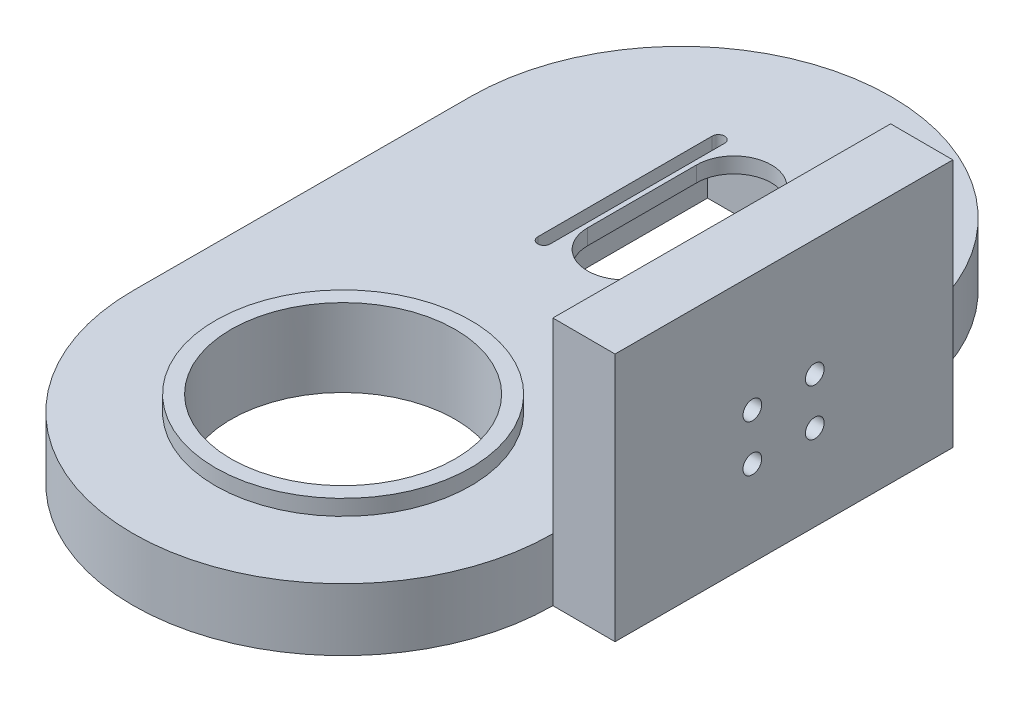
ISO-10303-21;
HEADER;
FILE_DESCRIPTION(('STEP AP214'),'2;1');
FILE_NAME('part.step','',(''),(''),'','','');
FILE_SCHEMA(('AUTOMOTIVE_DESIGN { 1 0 10303 214 1 1 1 1 }'));
ENDSEC;
DATA;
#1=APPLICATION_CONTEXT('core data for automotive mechanical design processes');
#2=APPLICATION_PROTOCOL_DEFINITION('international standard','automotive_design',2000,#1);
#3=PRODUCT_CONTEXT('',#1,'mechanical');
#4=PRODUCT('Part','Part','',(#3));
#5=PRODUCT_RELATED_PRODUCT_CATEGORY('part','',(#4));
#6=PRODUCT_DEFINITION_FORMATION('','',#4);
#7=PRODUCT_DEFINITION_CONTEXT('part definition',#1,'design');
#8=PRODUCT_DEFINITION('design','',#6,#7);
#9=PRODUCT_DEFINITION_SHAPE('','',#8);
#10=(LENGTH_UNIT() NAMED_UNIT(*) SI_UNIT(.MILLI.,.METRE.));
#11=(NAMED_UNIT(*) PLANE_ANGLE_UNIT() SI_UNIT($,.RADIAN.));
#12=(NAMED_UNIT(*) SI_UNIT($,.STERADIAN.) SOLID_ANGLE_UNIT());
#13=UNCERTAINTY_MEASURE_WITH_UNIT(LENGTH_MEASURE(1.E-05),#10,'distance_accuracy_value','');
#14=(GEOMETRIC_REPRESENTATION_CONTEXT(3) GLOBAL_UNCERTAINTY_ASSIGNED_CONTEXT((#13)) GLOBAL_UNIT_ASSIGNED_CONTEXT((#10,
#11,#12)) REPRESENTATION_CONTEXT('',''));
#15=CARTESIAN_POINT('',(0.,0.,0.));
#16=DIRECTION('',(0.,0.,1.));
#17=DIRECTION('',(1.,0.,0.));
#18=AXIS2_PLACEMENT_3D('',#15,#16,#17);
#19=CARTESIAN_POINT('',(0.,20.,0.));
#20=DIRECTION('',(0.,1.,0.));
#21=DIRECTION('',(0.,0.,1.));
#22=AXIS2_PLACEMENT_3D('',#19,#20,#21);
#23=PLANE('',#22);
#24=DIRECTION('',(-0.0022539145486872,0.,0.999997459931378));
#25=VECTOR('',#24,1.);
#26=CARTESIAN_POINT('',(-87.3971740912788,20.,-0.196986262557106));
#27=LINE('',#26,#25);
#28=CARTESIAN_POINT('',(-87.2559419597277,20.,-62.857646088402));
#29=VERTEX_POINT('',#28);
#30=CARTESIAN_POINT('',(-87.499828545368,20.,45.3478607679638));
#31=VERTEX_POINT('',#30);
#32=EDGE_CURVE('E346',#29,#31,#27,.T.);
#33=ORIENTED_EDGE('',*,*,#32,.T.);
#34=CARTESIAN_POINT('',(-20.,20.,45.5000000000001));
#35=DIRECTION('',(0.,1.,0.));
#36=DIRECTION('',(0.,0.,1.));
#37=AXIS2_PLACEMENT_3D('',#34,#35,#36);
#38=CIRCLE('',#37,67.5);
#39=CARTESIAN_POINT('',(47.4998285453679,20.,45.6521392320366));
#40=VERTEX_POINT('',#39);
#41=EDGE_CURVE('E349',#31,#40,#38,.T.);
#42=ORIENTED_EDGE('',*,*,#41,.T.);
#43=DIRECTION('',(0.00225391454868705,0.,-0.999997459931378));
#44=VECTOR('',#43,1.);
#45=CARTESIAN_POINT('',(47.6024829994571,20.,0.107292201515659));
#46=LINE('',#45,#44);
#47=CARTESIAN_POINT('',(47.7437151310082,20.,-62.5533676243292));
#48=VERTEX_POINT('',#47);
#49=EDGE_CURVE('E352',#40,#48,#46,.T.);
#50=ORIENTED_EDGE('',*,*,#49,.T.);
#51=CARTESIAN_POINT('',(-19.7561134143597,20.,-62.7055068563656));
#52=DIRECTION('',(0.,1.,0.));
#53=DIRECTION('',(0.,0.,1.));
#54=AXIS2_PLACEMENT_3D('',#51,#52,#53);
#55=CIRCLE('',#54,67.5);
#56=EDGE_CURVE('E354',#48,#29,#55,.T.);
#57=ORIENTED_EDGE('',*,*,#56,.T.);
#58=EDGE_LOOP('',(#33,#42,#50,#57));
#59=FACE_BOUND('',#58,.T.);
#60=CARTESIAN_POINT('',(-4.5,20.,-90.5));
#61=DIRECTION('',(0.,1.,0.));
#62=DIRECTION('',(0.,0.,1.));
#63=AXIS2_PLACEMENT_3D('',#60,#61,#62);
#64=CIRCLE('',#63,1.99999999999997);
#65=CARTESIAN_POINT('',(-2.50000000000003,20.,-90.5));
#66=VERTEX_POINT('',#65);
#67=CARTESIAN_POINT('',(-6.49999999999998,20.,-90.5));
#68=VERTEX_POINT('',#67);
#69=EDGE_CURVE('E379',#66,#68,#64,.T.);
#70=ORIENTED_EDGE('',*,*,#69,.F.);
#71=DIRECTION('',(0.,0.,1.));
#72=VECTOR('',#71,1.);
#73=CARTESIAN_POINT('',(-2.50000000000003,20.,0.));
#74=LINE('',#73,#72);
#75=CARTESIAN_POINT('',(-2.50000000000003,20.,-34.5));
#76=VERTEX_POINT('',#75);
#77=EDGE_CURVE('E371',#66,#76,#74,.T.);
#78=ORIENTED_EDGE('',*,*,#77,.T.);
#79=CARTESIAN_POINT('',(-4.5,20.,-34.5));
#80=DIRECTION('',(0.,1.,0.));
#81=DIRECTION('',(0.,0.,1.));
#82=AXIS2_PLACEMENT_3D('',#79,#80,#81);
#83=CIRCLE('',#82,1.99999999999997);
#84=CARTESIAN_POINT('',(-6.49999999999998,20.,-34.5));
#85=VERTEX_POINT('',#84);
#86=EDGE_CURVE('E374',#85,#76,#83,.T.);
#87=ORIENTED_EDGE('',*,*,#86,.F.);
#88=DIRECTION('',(0.,0.,1.));
#89=VECTOR('',#88,1.);
#90=CARTESIAN_POINT('',(-6.49999999999998,20.,0.));
#91=LINE('',#90,#89);
#92=EDGE_CURVE('E377',#68,#85,#91,.T.);
#93=ORIENTED_EDGE('',*,*,#92,.F.);
#94=EDGE_LOOP('',(#70,#78,#87,#93));
#95=FACE_BOUND('',#94,.T.);
#96=DIRECTION('',(0.,0.,1.));
#97=VECTOR('',#96,1.);
#98=CARTESIAN_POINT('',(-32.,20.,0.));
#99=LINE('',#98,#97);
#100=CARTESIAN_POINT('',(-32.,20.,-80.));
#101=VERTEX_POINT('',#100);
#102=CARTESIAN_POINT('',(-32.,20.,-45.));
#103=VERTEX_POINT('',#102);
#104=EDGE_CURVE('E388',#101,#103,#99,.T.);
#105=ORIENTED_EDGE('',*,*,#104,.F.);
#106=CARTESIAN_POINT('',(-20.,20.,-80.));
#107=DIRECTION('',(0.,1.,0.));
#108=DIRECTION('',(0.,0.,1.));
#109=AXIS2_PLACEMENT_3D('',#106,#107,#108);
#110=CIRCLE('',#109,12.);
#111=CARTESIAN_POINT('',(-8.00000000000001,20.,-80.));
#112=VERTEX_POINT('',#111);
#113=EDGE_CURVE('E381',#112,#101,#110,.T.);
#114=ORIENTED_EDGE('',*,*,#113,.F.);
#115=DIRECTION('',(0.,0.,1.));
#116=VECTOR('',#115,1.);
#117=CARTESIAN_POINT('',(-8.00000000000001,20.,0.));
#118=LINE('',#117,#116);
#119=CARTESIAN_POINT('',(-8.00000000000001,20.,-45.));
#120=VERTEX_POINT('',#119);
#121=EDGE_CURVE('E383',#112,#120,#118,.T.);
#122=ORIENTED_EDGE('',*,*,#121,.T.);
#123=CARTESIAN_POINT('',(-20.,20.,-45.));
#124=DIRECTION('',(0.,1.,0.));
#125=DIRECTION('',(0.,0.,1.));
#126=AXIS2_PLACEMENT_3D('',#123,#124,#125);
#127=CIRCLE('',#126,12.);
#128=EDGE_CURVE('E386',#103,#120,#127,.T.);
#129=ORIENTED_EDGE('',*,*,#128,.F.);
#130=EDGE_LOOP('',(#105,#114,#122,#129));
#131=FACE_BOUND('',#130,.T.);
#132=CARTESIAN_POINT('',(-35.5,20.,-90.5));
#133=DIRECTION('',(0.,1.,0.));
#134=DIRECTION('',(0.,0.,1.));
#135=AXIS2_PLACEMENT_3D('',#132,#133,#134);
#136=CIRCLE('',#135,2.);
#137=CARTESIAN_POINT('',(-33.5,20.,-90.5));
#138=VERTEX_POINT('',#137);
#139=CARTESIAN_POINT('',(-37.5,20.,-90.5));
#140=VERTEX_POINT('',#139);
#141=EDGE_CURVE('E11',#138,#140,#136,.T.);
#142=ORIENTED_EDGE('',*,*,#141,.F.);
#143=DIRECTION('',(0.,0.,1.));
#144=VECTOR('',#143,1.);
#145=CARTESIAN_POINT('',(-33.5,20.,0.));
#146=LINE('',#145,#144);
#147=CARTESIAN_POINT('',(-33.5,20.,-34.5));
#148=VERTEX_POINT('',#147);
#149=EDGE_CURVE('E390',#138,#148,#146,.T.);
#150=ORIENTED_EDGE('',*,*,#149,.T.);
#151=CARTESIAN_POINT('',(-35.5,20.,-34.5));
#152=DIRECTION('',(0.,1.,0.));
#153=DIRECTION('',(0.,0.,1.));
#154=AXIS2_PLACEMENT_3D('',#151,#152,#153);
#155=CIRCLE('',#154,2.);
#156=CARTESIAN_POINT('',(-37.5,20.,-34.5));
#157=VERTEX_POINT('',#156);
#158=EDGE_CURVE('E393',#157,#148,#155,.T.);
#159=ORIENTED_EDGE('',*,*,#158,.F.);
#160=DIRECTION('',(0.,0.,1.));
#161=VECTOR('',#160,1.);
#162=CARTESIAN_POINT('',(-37.5,20.,0.));
#163=LINE('',#162,#161);
#164=EDGE_CURVE('E45',#140,#157,#163,.T.);
#165=ORIENTED_EDGE('',*,*,#164,.F.);
#166=EDGE_LOOP('',(#142,#150,#159,#165));
#167=FACE_BOUND('',#166,.T.);
#168=CARTESIAN_POINT('',(-20.,20.,45.5));
#169=DIRECTION('',(0.,1.,0.));
#170=DIRECTION('',(0.,0.,1.));
#171=AXIS2_PLACEMENT_3D('',#168,#169,#170);
#172=CIRCLE('',#171,41.);
#173=CARTESIAN_POINT('',(-20.,20.,86.5));
#174=VERTEX_POINT('',#173);
#175=EDGE_CURVE('E236',#174,#174,#172,.T.);
#176=ORIENTED_EDGE('',*,*,#175,.F.);
#177=EDGE_LOOP('',(#176));
#178=FACE_BOUND('',#177,.T.);
#179=ADVANCED_FACE('F37',(#59,#95,#131,#167,#178),#23,.T.);
#180=CARTESIAN_POINT('',(0.,15.,0.));
#181=DIRECTION('',(0.,-1.,0.));
#182=DIRECTION('',(0.,0.,-1.));
#183=AXIS2_PLACEMENT_3D('',#180,#181,#182);
#184=PLANE('',#183);
#185=CARTESIAN_POINT('',(-35.5,15.,-90.5));
#186=DIRECTION('',(0.,-1.,0.));
#187=DIRECTION('',(0.,0.,-1.));
#188=AXIS2_PLACEMENT_3D('',#185,#186,#187);
#189=CIRCLE('',#188,2.);
#190=CARTESIAN_POINT('',(-37.5,15.,-90.5));
#191=VERTEX_POINT('',#190);
#192=CARTESIAN_POINT('',(-35.5,15.,-92.5));
#193=VERTEX_POINT('',#192);
#194=EDGE_CURVE('E251',#191,#193,#189,.T.);
#195=ORIENTED_EDGE('',*,*,#194,.F.);
#196=DIRECTION('',(0.,0.,-1.));
#197=VECTOR('',#196,1.);
#198=CARTESIAN_POINT('',(-37.5,15.,0.));
#199=LINE('',#198,#197);
#200=CARTESIAN_POINT('',(-37.5,15.,-34.5));
#201=VERTEX_POINT('',#200);
#202=EDGE_CURVE('E259',#201,#191,#199,.T.);
#203=ORIENTED_EDGE('',*,*,#202,.F.);
#204=CARTESIAN_POINT('',(-35.5,15.,-34.5));
#205=DIRECTION('',(0.,-1.,0.));
#206=DIRECTION('',(0.,0.,-1.));
#207=AXIS2_PLACEMENT_3D('',#204,#205,#206);
#208=CIRCLE('',#207,2.);
#209=CARTESIAN_POINT('',(-35.5,15.,-32.5));
#210=VERTEX_POINT('',#209);
#211=EDGE_CURVE('E52',#210,#201,#208,.T.);
#212=ORIENTED_EDGE('',*,*,#211,.F.);
#213=DIRECTION('',(-1.,0.,0.));
#214=VECTOR('',#213,1.);
#215=CARTESIAN_POINT('',(0.,15.,-32.5));
#216=LINE('',#215,#214);
#217=CARTESIAN_POINT('',(-41.,15.,-32.5));
#218=VERTEX_POINT('',#217);
#219=EDGE_CURVE('E316',#210,#218,#216,.T.);
#220=ORIENTED_EDGE('',*,*,#219,.T.);
#221=DIRECTION('',(0.,0.,-1.));
#222=VECTOR('',#221,1.);
#223=CARTESIAN_POINT('',(-41.,15.,0.));
#224=LINE('',#223,#222);
#225=CARTESIAN_POINT('',(-41.,15.,-92.5));
#226=VERTEX_POINT('',#225);
#227=EDGE_CURVE('E314',#218,#226,#224,.T.);
#228=ORIENTED_EDGE('',*,*,#227,.T.);
#229=DIRECTION('',(-1.,0.,0.));
#230=VECTOR('',#229,1.);
#231=CARTESIAN_POINT('',(0.,15.,-92.5));
#232=LINE('',#231,#230);
#233=EDGE_CURVE('E319',#193,#226,#232,.T.);
#234=ORIENTED_EDGE('',*,*,#233,.F.);
#235=EDGE_LOOP('',(#195,#203,#212,#220,#228,#234));
#236=FACE_BOUND('',#235,.T.);
#237=ADVANCED_FACE('F422',(#236),#184,.T.);
#238=CARTESIAN_POINT('',(-33.5,15.,-90.5));
#239=VERTEX_POINT('',#238);
#240=EDGE_CURVE('E254',#193,#239,#189,.T.);
#241=ORIENTED_EDGE('',*,*,#240,.F.);
#242=CARTESIAN_POINT('',(-4.5,15.,-92.5));
#243=VERTEX_POINT('',#242);
#244=EDGE_CURVE('E324',#243,#193,#232,.T.);
#245=ORIENTED_EDGE('',*,*,#244,.F.);
#246=CARTESIAN_POINT('',(-4.5,15.,-90.5));
#247=DIRECTION('',(0.,-1.,0.));
#248=DIRECTION('',(0.,0.,-1.));
#249=AXIS2_PLACEMENT_3D('',#246,#247,#248);
#250=CIRCLE('',#249,1.99999999999997);
#251=CARTESIAN_POINT('',(-6.49999999999998,15.,-90.5));
#252=VERTEX_POINT('',#251);
#253=EDGE_CURVE('E291',#252,#243,#250,.T.);
#254=ORIENTED_EDGE('',*,*,#253,.F.);
#255=DIRECTION('',(0.,0.,-1.));
#256=VECTOR('',#255,1.);
#257=CARTESIAN_POINT('',(-6.49999999999998,15.,0.));
#258=LINE('',#257,#256);
#259=CARTESIAN_POINT('',(-6.49999999999998,15.,-34.5));
#260=VERTEX_POINT('',#259);
#261=EDGE_CURVE('E299',#260,#252,#258,.T.);
#262=ORIENTED_EDGE('',*,*,#261,.F.);
#263=CARTESIAN_POINT('',(-4.5,15.,-34.5));
#264=DIRECTION('',(0.,-1.,0.));
#265=DIRECTION('',(0.,0.,-1.));
#266=AXIS2_PLACEMENT_3D('',#263,#264,#265);
#267=CIRCLE('',#266,1.99999999999997);
#268=CARTESIAN_POINT('',(-4.5,15.,-32.5));
#269=VERTEX_POINT('',#268);
#270=EDGE_CURVE('E296',#269,#260,#267,.T.);
#271=ORIENTED_EDGE('',*,*,#270,.F.);
#272=EDGE_CURVE('E315',#269,#210,#216,.T.);
#273=ORIENTED_EDGE('',*,*,#272,.T.);
#274=CARTESIAN_POINT('',(-33.5,15.,-34.5));
#275=VERTEX_POINT('',#274);
#276=EDGE_CURVE('E257',#275,#210,#208,.T.);
#277=ORIENTED_EDGE('',*,*,#276,.F.);
#278=DIRECTION('',(0.,0.,-1.));
#279=VECTOR('',#278,1.);
#280=CARTESIAN_POINT('',(-33.5,15.,0.));
#281=LINE('',#280,#279);
#282=EDGE_CURVE('E253',#275,#239,#281,.T.);
#283=ORIENTED_EDGE('',*,*,#282,.T.);
#284=EDGE_LOOP('',(#241,#245,#254,#262,#271,#273,#277,#283));
#285=FACE_BOUND('',#284,.T.);
#286=DIRECTION('',(0.,0.,-1.));
#287=VECTOR('',#286,1.);
#288=CARTESIAN_POINT('',(-32.,15.,0.));
#289=LINE('',#288,#287);
#290=CARTESIAN_POINT('',(-32.,15.,-45.));
#291=VERTEX_POINT('',#290);
#292=CARTESIAN_POINT('',(-32.,15.,-80.));
#293=VERTEX_POINT('',#292);
#294=EDGE_CURVE('E272',#291,#293,#289,.T.);
#295=ORIENTED_EDGE('',*,*,#294,.F.);
#296=CARTESIAN_POINT('',(-20.,15.,-45.));
#297=DIRECTION('',(0.,-1.,0.));
#298=DIRECTION('',(0.,0.,-1.));
#299=AXIS2_PLACEMENT_3D('',#296,#297,#298);
#300=CIRCLE('',#299,12.);
#301=CARTESIAN_POINT('',(-8.00000000000001,15.,-45.));
#302=VERTEX_POINT('',#301);
#303=EDGE_CURVE('E280',#302,#291,#300,.T.);
#304=ORIENTED_EDGE('',*,*,#303,.F.);
#305=DIRECTION('',(0.,0.,-1.));
#306=VECTOR('',#305,1.);
#307=CARTESIAN_POINT('',(-8.00000000000001,15.,0.));
#308=LINE('',#307,#306);
#309=CARTESIAN_POINT('',(-8.00000000000001,15.,-80.));
#310=VERTEX_POINT('',#309);
#311=EDGE_CURVE('E60',#302,#310,#308,.T.);
#312=ORIENTED_EDGE('',*,*,#311,.T.);
#313=CARTESIAN_POINT('',(-20.,15.,-80.));
#314=DIRECTION('',(0.,-1.,0.));
#315=DIRECTION('',(0.,0.,-1.));
#316=AXIS2_PLACEMENT_3D('',#313,#314,#315);
#317=CIRCLE('',#316,12.);
#318=EDGE_CURVE('E275',#293,#310,#317,.T.);
#319=ORIENTED_EDGE('',*,*,#318,.F.);
#320=EDGE_LOOP('',(#295,#304,#312,#319));
#321=FACE_BOUND('',#320,.T.);
#322=ADVANCED_FACE('F416',(#285,#321),#184,.T.);
#323=CARTESIAN_POINT('',(-87.3971740912788,20.,-0.196986262557106));
#324=DIRECTION('',(0.999997459931378,0.,0.0022539145486872));
#325=DIRECTION('',(0.0022539145486872,0.,-0.999997459931378));
#326=AXIS2_PLACEMENT_3D('',#323,#324,#325);
#327=PLANE('',#326);
#328=DIRECTION('',(-0.0022539145486872,0.,0.999997459931378));
#329=VECTOR('',#328,1.);
#330=CARTESIAN_POINT('',(-87.3971740912788,0.,-0.196986262557106));
#331=LINE('',#330,#329);
#332=CARTESIAN_POINT('',(-87.2559419597277,0.,-62.857646088402));
#333=VERTEX_POINT('',#332);
#334=CARTESIAN_POINT('',(-87.499828545368,0.,45.3478607679638));
#335=VERTEX_POINT('',#334);
#336=EDGE_CURVE('E339',#333,#335,#331,.T.);
#337=ORIENTED_EDGE('',*,*,#336,.T.);
#338=DIRECTION('',(0.,-1.,0.));
#339=VECTOR('',#338,1.);
#340=CARTESIAN_POINT('',(-87.499828545368,20.,45.3478607679638));
#341=LINE('',#340,#339);
#342=EDGE_CURVE('E368',#31,#335,#341,.T.);
#343=ORIENTED_EDGE('',*,*,#342,.F.);
#344=ORIENTED_EDGE('',*,*,#32,.F.);
#345=DIRECTION('',(0.,-1.,0.));
#346=VECTOR('',#345,1.);
#347=CARTESIAN_POINT('',(-87.2559419597277,20.,-62.857646088402));
#348=LINE('',#347,#346);
#349=EDGE_CURVE('E356',#29,#333,#348,.T.);
#350=ORIENTED_EDGE('',*,*,#349,.T.);
#351=EDGE_LOOP('',(#337,#343,#344,#350));
#352=FACE_BOUND('',#351,.T.);
#353=ADVANCED_FACE('F39',(#352),#327,.F.);
#354=CARTESIAN_POINT('',(-20.,20.,45.5000000000001));
#355=DIRECTION('',(0.,-1.,0.));
#356=DIRECTION('',(0.,0.,-1.));
#357=AXIS2_PLACEMENT_3D('',#354,#355,#356);
#358=CYLINDRICAL_SURFACE('',#357,67.5);
#359=CARTESIAN_POINT('',(-20.,0.,45.5000000000001));
#360=DIRECTION('',(0.,1.,0.));
#361=DIRECTION('',(0.,0.,1.));
#362=AXIS2_PLACEMENT_3D('',#359,#360,#361);
#363=CIRCLE('',#362,67.5);
#364=CARTESIAN_POINT('',(47.4998285453679,0.,45.6521392320366));
#365=VERTEX_POINT('',#364);
#366=EDGE_CURVE('E359',#335,#365,#363,.T.);
#367=ORIENTED_EDGE('',*,*,#366,.T.);
#368=DIRECTION('',(0.,-1.,0.));
#369=VECTOR('',#368,1.);
#370=CARTESIAN_POINT('',(47.4998285453679,20.,45.6521392320366));
#371=LINE('',#370,#369);
#372=EDGE_CURVE('E232',#40,#365,#371,.T.);
#373=ORIENTED_EDGE('',*,*,#372,.F.);
#374=ORIENTED_EDGE('',*,*,#41,.F.);
#375=ORIENTED_EDGE('',*,*,#342,.T.);
#376=EDGE_LOOP('',(#367,#373,#374,#375));
#377=FACE_BOUND('',#376,.T.);
#378=ADVANCED_FACE('F485',(#377),#358,.T.);
#379=CARTESIAN_POINT('',(-19.7561134143597,20.,-62.7055068563656));
#380=DIRECTION('',(0.,-1.,0.));
#381=DIRECTION('',(0.,0.,-1.));
#382=AXIS2_PLACEMENT_3D('',#379,#380,#381);
#383=CYLINDRICAL_SURFACE('',#382,67.5);
#384=CARTESIAN_POINT('',(-19.7561134143597,0.,-62.7055068563656));
#385=DIRECTION('',(0.,1.,0.));
#386=DIRECTION('',(0.,0.,1.));
#387=AXIS2_PLACEMENT_3D('',#384,#385,#386);
#388=CIRCLE('',#387,67.5);
#389=CARTESIAN_POINT('',(47.7437151310083,0.,-62.5533676243292));
#390=VERTEX_POINT('',#389);
#391=EDGE_CURVE('E350',#390,#333,#388,.T.);
#392=ORIENTED_EDGE('',*,*,#391,.T.);
#393=ORIENTED_EDGE('',*,*,#349,.F.);
#394=ORIENTED_EDGE('',*,*,#56,.F.);
#395=DIRECTION('',(0.,-1.,0.));
#396=VECTOR('',#395,1.);
#397=CARTESIAN_POINT('',(47.7437151310082,20.,-62.5533676243292));
#398=LINE('',#397,#396);
#399=EDGE_CURVE('E364',#48,#390,#398,.T.);
#400=ORIENTED_EDGE('',*,*,#399,.T.);
#401=EDGE_LOOP('',(#392,#393,#394,#400));
#402=FACE_BOUND('',#401,.T.);
#403=ADVANCED_FACE('F482',(#402),#383,.T.);
#404=CARTESIAN_POINT('',(0.,0.,0.));
#405=DIRECTION('',(0.,1.,0.));
#406=DIRECTION('',(0.,0.,1.));
#407=AXIS2_PLACEMENT_3D('',#404,#405,#406);
#408=PLANE('',#407);
#409=CARTESIAN_POINT('',(-20.,0.,45.5));
#410=DIRECTION('',(0.,-1.,0.));
#411=DIRECTION('',(0.,0.,-1.));
#412=AXIS2_PLACEMENT_3D('',#409,#410,#411);
#413=CIRCLE('',#412,36.);
#414=CARTESIAN_POINT('',(-20.,0.,9.50000000000002));
#415=VERTEX_POINT('',#414);
#416=EDGE_CURVE('E245',#415,#415,#413,.T.);
#417=ORIENTED_EDGE('',*,*,#416,.F.);
#418=EDGE_LOOP('',(#417));
#419=FACE_BOUND('',#418,.T.);
#420=DIRECTION('',(0.,0.,-1.));
#421=VECTOR('',#420,1.);
#422=CARTESIAN_POINT('',(-41.,0.,0.));
#423=LINE('',#422,#421);
#424=CARTESIAN_POINT('',(-41.,0.,-32.5));
#425=VERTEX_POINT('',#424);
#426=CARTESIAN_POINT('',(-41.,0.,-92.5));
#427=VERTEX_POINT('',#426);
#428=EDGE_CURVE('E328',#425,#427,#423,.T.);
#429=ORIENTED_EDGE('',*,*,#428,.F.);
#430=DIRECTION('',(-1.,0.,0.));
#431=VECTOR('',#430,1.);
#432=CARTESIAN_POINT('',(0.,0.,-32.5));
#433=LINE('',#432,#431);
#434=CARTESIAN_POINT('',(0.999999999999973,0.,-32.5));
#435=VERTEX_POINT('',#434);
#436=EDGE_CURVE('E265',#435,#425,#433,.T.);
#437=ORIENTED_EDGE('',*,*,#436,.F.);
#438=DIRECTION('',(0.,0.,-1.));
#439=VECTOR('',#438,1.);
#440=CARTESIAN_POINT('',(0.99999999999997,0.,0.));
#441=LINE('',#440,#439);
#442=CARTESIAN_POINT('',(0.999999999999978,0.,-92.5));
#443=VERTEX_POINT('',#442);
#444=EDGE_CURVE('E334',#435,#443,#441,.T.);
#445=ORIENTED_EDGE('',*,*,#444,.T.);
#446=DIRECTION('',(-1.,0.,0.));
#447=VECTOR('',#446,1.);
#448=CARTESIAN_POINT('',(0.,0.,-92.5));
#449=LINE('',#448,#447);
#450=EDGE_CURVE('E331',#443,#427,#449,.T.);
#451=ORIENTED_EDGE('',*,*,#450,.T.);
#452=EDGE_LOOP('',(#429,#437,#445,#451));
#453=FACE_BOUND('',#452,.T.);
#454=ORIENTED_EDGE('',*,*,#336,.F.);
#455=ORIENTED_EDGE('',*,*,#391,.F.);
#456=DIRECTION('',(-0.999997459931378,0.,-0.00225391454868705));
#457=VECTOR('',#456,1.);
#458=CARTESIAN_POINT('',(67.7436643296358,0.,-62.5082893333555));
#459=LINE('',#458,#457);
#460=CARTESIAN_POINT('',(67.7436643296358,0.,-62.5082893333555));
#461=VERTEX_POINT('',#460);
#462=EDGE_CURVE('E212',#461,#390,#459,.T.);
#463=ORIENTED_EDGE('',*,*,#462,.F.);
#464=DIRECTION('',(0.00225391454868707,0.,-0.999997459931377));
#465=VECTOR('',#464,1.);
#466=CARTESIAN_POINT('',(67.7436643296358,0.,-62.5082893333555));
#467=LINE('',#466,#465);
#468=CARTESIAN_POINT('',(67.4997777439955,0.,45.6972175230103));
#469=VERTEX_POINT('',#468);
#470=EDGE_CURVE('E205',#469,#461,#467,.T.);
#471=ORIENTED_EDGE('',*,*,#470,.F.);
#472=DIRECTION('',(-0.999997459931378,0.,-0.00225391454868705));
#473=VECTOR('',#472,1.);
#474=CARTESIAN_POINT('',(67.4997777439955,0.,45.6972175230103));
#475=LINE('',#474,#473);
#476=EDGE_CURVE('E210',#469,#365,#475,.T.);
#477=ORIENTED_EDGE('',*,*,#476,.T.);
#478=ORIENTED_EDGE('',*,*,#366,.F.);
#479=EDGE_LOOP('',(#454,#455,#463,#471,#477,#478));
#480=FACE_BOUND('',#479,.T.);
#481=ADVANCED_FACE('F208',(#419,#453,#480),#408,.F.);
#482=CARTESIAN_POINT('',(0.,15.,-32.5));
#483=DIRECTION('',(0.,0.,1.));
#484=DIRECTION('',(1.,0.,0.));
#485=AXIS2_PLACEMENT_3D('',#482,#483,#484);
#486=PLANE('',#485);
#487=ORIENTED_EDGE('',*,*,#436,.T.);
#488=DIRECTION('',(0.,-1.,0.));
#489=VECTOR('',#488,1.);
#490=CARTESIAN_POINT('',(-41.,15.,-32.5));
#491=LINE('',#490,#489);
#492=EDGE_CURVE('E326',#218,#425,#491,.T.);
#493=ORIENTED_EDGE('',*,*,#492,.F.);
#494=ORIENTED_EDGE('',*,*,#219,.F.);
#495=ORIENTED_EDGE('',*,*,#272,.F.);
#496=CARTESIAN_POINT('',(0.999999999999973,15.,-32.5));
#497=VERTEX_POINT('',#496);
#498=EDGE_CURVE('E311',#497,#269,#216,.T.);
#499=ORIENTED_EDGE('',*,*,#498,.F.);
#500=DIRECTION('',(0.,-1.,0.));
#501=VECTOR('',#500,1.);
#502=CARTESIAN_POINT('',(0.999999999999973,15.,-32.5));
#503=LINE('',#502,#501);
#504=EDGE_CURVE('E337',#497,#435,#503,.T.);
#505=ORIENTED_EDGE('',*,*,#504,.T.);
#506=EDGE_LOOP('',(#487,#493,#494,#495,#499,#505));
#507=FACE_BOUND('',#506,.T.);
#508=ADVANCED_FACE('F458',(#507),#486,.F.);
#509=CARTESIAN_POINT('',(0.99999999999997,15.,0.));
#510=DIRECTION('',(-1.,0.,0.));
#511=DIRECTION('',(0.,0.,1.));
#512=AXIS2_PLACEMENT_3D('',#509,#510,#511);
#513=PLANE('',#512);
#514=ORIENTED_EDGE('',*,*,#444,.F.);
#515=ORIENTED_EDGE('',*,*,#504,.F.);
#516=DIRECTION('',(0.,0.,-1.));
#517=VECTOR('',#516,1.);
#518=CARTESIAN_POINT('',(0.99999999999997,15.,0.));
#519=LINE('',#518,#517);
#520=CARTESIAN_POINT('',(0.999999999999978,15.,-92.5));
#521=VERTEX_POINT('',#520);
#522=EDGE_CURVE('E323',#497,#521,#519,.T.);
#523=ORIENTED_EDGE('',*,*,#522,.T.);
#524=DIRECTION('',(0.,-1.,0.));
#525=VECTOR('',#524,1.);
#526=CARTESIAN_POINT('',(0.999999999999978,15.,-92.5));
#527=LINE('',#526,#525);
#528=EDGE_CURVE('E340',#521,#443,#527,.T.);
#529=ORIENTED_EDGE('',*,*,#528,.T.);
#530=EDGE_LOOP('',(#514,#515,#523,#529));
#531=FACE_BOUND('',#530,.T.);
#532=ADVANCED_FACE('F633',(#531),#513,.T.);
#533=CARTESIAN_POINT('',(0.,15.,-92.5));
#534=DIRECTION('',(0.,0.,1.));
#535=DIRECTION('',(1.,0.,0.));
#536=AXIS2_PLACEMENT_3D('',#533,#534,#535);
#537=PLANE('',#536);
#538=ORIENTED_EDGE('',*,*,#450,.F.);
#539=ORIENTED_EDGE('',*,*,#528,.F.);
#540=EDGE_CURVE('E320',#521,#243,#232,.T.);
#541=ORIENTED_EDGE('',*,*,#540,.T.);
#542=ORIENTED_EDGE('',*,*,#244,.T.);
#543=ORIENTED_EDGE('',*,*,#233,.T.);
#544=DIRECTION('',(0.,-1.,0.));
#545=VECTOR('',#544,1.);
#546=CARTESIAN_POINT('',(-41.,15.,-92.5));
#547=LINE('',#546,#545);
#548=EDGE_CURVE('E342',#226,#427,#547,.T.);
#549=ORIENTED_EDGE('',*,*,#548,.T.);
#550=EDGE_LOOP('',(#538,#539,#541,#542,#543,#549));
#551=FACE_BOUND('',#550,.T.);
#552=ADVANCED_FACE('F427',(#551),#537,.T.);
#553=CARTESIAN_POINT('',(-41.,15.,0.));
#554=DIRECTION('',(-1.,0.,0.));
#555=DIRECTION('',(0.,0.,1.));
#556=AXIS2_PLACEMENT_3D('',#553,#554,#555);
#557=PLANE('',#556);
#558=ORIENTED_EDGE('',*,*,#428,.T.);
#559=ORIENTED_EDGE('',*,*,#548,.F.);
#560=ORIENTED_EDGE('',*,*,#227,.F.);
#561=ORIENTED_EDGE('',*,*,#492,.T.);
#562=EDGE_LOOP('',(#558,#559,#560,#561));
#563=FACE_BOUND('',#562,.T.);
#564=ADVANCED_FACE('F624',(#563),#557,.F.);
#565=CARTESIAN_POINT('',(-2.50000000000003,15.,-90.5));
#566=VERTEX_POINT('',#565);
#567=EDGE_CURVE('E250',#243,#566,#250,.T.);
#568=ORIENTED_EDGE('',*,*,#567,.F.);
#569=ORIENTED_EDGE('',*,*,#540,.F.);
#570=ORIENTED_EDGE('',*,*,#522,.F.);
#571=ORIENTED_EDGE('',*,*,#498,.T.);
#572=CARTESIAN_POINT('',(-2.50000000000003,15.,-34.5));
#573=VERTEX_POINT('',#572);
#574=EDGE_CURVE('E297',#573,#269,#267,.T.);
#575=ORIENTED_EDGE('',*,*,#574,.F.);
#576=DIRECTION('',(0.,0.,-1.));
#577=VECTOR('',#576,1.);
#578=CARTESIAN_POINT('',(-2.50000000000003,15.,0.));
#579=LINE('',#578,#577);
#580=EDGE_CURVE('E293',#573,#566,#579,.T.);
#581=ORIENTED_EDGE('',*,*,#580,.T.);
#582=EDGE_LOOP('',(#568,#569,#570,#571,#575,#581));
#583=FACE_BOUND('',#582,.T.);
#584=ADVANCED_FACE('F433',(#583),#184,.T.);
#585=CARTESIAN_POINT('',(-4.5,35.,-90.5));
#586=DIRECTION('',(0.,-1.,0.));
#587=DIRECTION('',(0.,0.,-1.));
#588=AXIS2_PLACEMENT_3D('',#585,#586,#587);
#589=CYLINDRICAL_SURFACE('',#588,1.99999999999997);
#590=ORIENTED_EDGE('',*,*,#69,.T.);
#591=DIRECTION('',(0.,-1.,0.));
#592=VECTOR('',#591,1.);
#593=CARTESIAN_POINT('',(-6.49999999999998,35.,-90.5));
#594=LINE('',#593,#592);
#595=EDGE_CURVE('E276',#68,#252,#594,.T.);
#596=ORIENTED_EDGE('',*,*,#595,.T.);
#597=ORIENTED_EDGE('',*,*,#253,.T.);
#598=ORIENTED_EDGE('',*,*,#567,.T.);
#599=DIRECTION('',(0.,-1.,0.));
#600=VECTOR('',#599,1.);
#601=CARTESIAN_POINT('',(-2.50000000000003,35.,-90.5));
#602=LINE('',#601,#600);
#603=EDGE_CURVE('E302',#66,#566,#602,.T.);
#604=ORIENTED_EDGE('',*,*,#603,.F.);
#605=EDGE_LOOP('',(#590,#596,#597,#598,#604));
#606=FACE_BOUND('',#605,.T.);
#607=ADVANCED_FACE('F439',(#606),#589,.F.);
#608=CARTESIAN_POINT('',(-6.49999999999998,35.,0.));
#609=DIRECTION('',(-1.,0.,0.));
#610=DIRECTION('',(0.,0.,1.));
#611=AXIS2_PLACEMENT_3D('',#608,#609,#610);
#612=PLANE('',#611);
#613=ORIENTED_EDGE('',*,*,#92,.T.);
#614=DIRECTION('',(0.,-1.,0.));
#615=VECTOR('',#614,1.);
#616=CARTESIAN_POINT('',(-6.49999999999998,35.,-34.5));
#617=LINE('',#616,#615);
#618=EDGE_CURVE('E304',#85,#260,#617,.T.);
#619=ORIENTED_EDGE('',*,*,#618,.T.);
#620=ORIENTED_EDGE('',*,*,#261,.T.);
#621=ORIENTED_EDGE('',*,*,#595,.F.);
#622=EDGE_LOOP('',(#613,#619,#620,#621));
#623=FACE_BOUND('',#622,.T.);
#624=ADVANCED_FACE('F449',(#623),#612,.F.);
#625=CARTESIAN_POINT('',(-4.5,35.,-34.5));
#626=DIRECTION('',(0.,-1.,0.));
#627=DIRECTION('',(0.,0.,-1.));
#628=AXIS2_PLACEMENT_3D('',#625,#626,#627);
#629=CYLINDRICAL_SURFACE('',#628,1.99999999999997);
#630=ORIENTED_EDGE('',*,*,#86,.T.);
#631=DIRECTION('',(0.,-1.,0.));
#632=VECTOR('',#631,1.);
#633=CARTESIAN_POINT('',(-2.50000000000003,35.,-34.5));
#634=LINE('',#633,#632);
#635=EDGE_CURVE('E307',#76,#573,#634,.T.);
#636=ORIENTED_EDGE('',*,*,#635,.T.);
#637=ORIENTED_EDGE('',*,*,#574,.T.);
#638=ORIENTED_EDGE('',*,*,#270,.T.);
#639=ORIENTED_EDGE('',*,*,#618,.F.);
#640=EDGE_LOOP('',(#630,#636,#637,#638,#639));
#641=FACE_BOUND('',#640,.T.);
#642=ADVANCED_FACE('F460',(#641),#629,.F.);
#643=CARTESIAN_POINT('',(-2.50000000000003,35.,0.));
#644=DIRECTION('',(-1.,0.,0.));
#645=DIRECTION('',(0.,0.,1.));
#646=AXIS2_PLACEMENT_3D('',#643,#644,#645);
#647=PLANE('',#646);
#648=ORIENTED_EDGE('',*,*,#603,.T.);
#649=ORIENTED_EDGE('',*,*,#580,.F.);
#650=ORIENTED_EDGE('',*,*,#635,.F.);
#651=ORIENTED_EDGE('',*,*,#77,.F.);
#652=EDGE_LOOP('',(#648,#649,#650,#651));
#653=FACE_BOUND('',#652,.T.);
#654=ADVANCED_FACE('F442',(#653),#647,.T.);
#655=CARTESIAN_POINT('',(-32.,35.,0.));
#656=DIRECTION('',(-1.,0.,0.));
#657=DIRECTION('',(0.,0.,1.));
#658=AXIS2_PLACEMENT_3D('',#655,#656,#657);
#659=PLANE('',#658);
#660=ORIENTED_EDGE('',*,*,#104,.T.);
#661=DIRECTION('',(0.,-1.,0.));
#662=VECTOR('',#661,1.);
#663=CARTESIAN_POINT('',(-32.,35.,-45.));
#664=LINE('',#663,#662);
#665=EDGE_CURVE('E284',#103,#291,#664,.T.);
#666=ORIENTED_EDGE('',*,*,#665,.T.);
#667=ORIENTED_EDGE('',*,*,#294,.T.);
#668=DIRECTION('',(0.,-1.,0.));
#669=VECTOR('',#668,1.);
#670=CARTESIAN_POINT('',(-32.,35.,-80.));
#671=LINE('',#670,#669);
#672=EDGE_CURVE('E283',#101,#293,#671,.T.);
#673=ORIENTED_EDGE('',*,*,#672,.F.);
#674=EDGE_LOOP('',(#660,#666,#667,#673));
#675=FACE_BOUND('',#674,.T.);
#676=ADVANCED_FACE('F467',(#675),#659,.F.);
#677=CARTESIAN_POINT('',(-20.,35.,-45.));
#678=DIRECTION('',(0.,-1.,0.));
#679=DIRECTION('',(0.,0.,-1.));
#680=AXIS2_PLACEMENT_3D('',#677,#678,#679);
#681=CYLINDRICAL_SURFACE('',#680,12.);
#682=ORIENTED_EDGE('',*,*,#128,.T.);
#683=DIRECTION('',(0.,-1.,0.));
#684=VECTOR('',#683,1.);
#685=CARTESIAN_POINT('',(-8.00000000000001,35.,-45.));
#686=LINE('',#685,#684);
#687=EDGE_CURVE('E286',#120,#302,#686,.T.);
#688=ORIENTED_EDGE('',*,*,#687,.T.);
#689=ORIENTED_EDGE('',*,*,#303,.T.);
#690=ORIENTED_EDGE('',*,*,#665,.F.);
#691=EDGE_LOOP('',(#682,#688,#689,#690));
#692=FACE_BOUND('',#691,.T.);
#693=ADVANCED_FACE('F595',(#692),#681,.F.);
#694=CARTESIAN_POINT('',(-8.00000000000001,35.,0.));
#695=DIRECTION('',(-1.,0.,0.));
#696=DIRECTION('',(0.,0.,1.));
#697=AXIS2_PLACEMENT_3D('',#694,#695,#696);
#698=PLANE('',#697);
#699=DIRECTION('',(0.,-1.,0.));
#700=VECTOR('',#699,1.);
#701=CARTESIAN_POINT('',(-8.00000000000001,35.,-80.));
#702=LINE('',#701,#700);
#703=EDGE_CURVE('E288',#112,#310,#702,.T.);
#704=ORIENTED_EDGE('',*,*,#703,.T.);
#705=ORIENTED_EDGE('',*,*,#311,.F.);
#706=ORIENTED_EDGE('',*,*,#687,.F.);
#707=ORIENTED_EDGE('',*,*,#121,.F.);
#708=EDGE_LOOP('',(#704,#705,#706,#707));
#709=FACE_BOUND('',#708,.T.);
#710=ADVANCED_FACE('F598',(#709),#698,.T.);
#711=CARTESIAN_POINT('',(-20.,35.,-80.));
#712=DIRECTION('',(0.,-1.,0.));
#713=DIRECTION('',(0.,0.,-1.));
#714=AXIS2_PLACEMENT_3D('',#711,#712,#713);
#715=CYLINDRICAL_SURFACE('',#714,12.);
#716=ORIENTED_EDGE('',*,*,#113,.T.);
#717=ORIENTED_EDGE('',*,*,#672,.T.);
#718=ORIENTED_EDGE('',*,*,#318,.T.);
#719=ORIENTED_EDGE('',*,*,#703,.F.);
#720=EDGE_LOOP('',(#716,#717,#718,#719));
#721=FACE_BOUND('',#720,.T.);
#722=ADVANCED_FACE('F594',(#721),#715,.F.);
#723=CARTESIAN_POINT('',(-35.5,35.,-90.5));
#724=DIRECTION('',(0.,-1.,0.));
#725=DIRECTION('',(0.,0.,-1.));
#726=AXIS2_PLACEMENT_3D('',#723,#724,#725);
#727=CYLINDRICAL_SURFACE('',#726,2.);
#728=ORIENTED_EDGE('',*,*,#141,.T.);
#729=DIRECTION('',(0.,-1.,0.));
#730=VECTOR('',#729,1.);
#731=CARTESIAN_POINT('',(-37.5,35.,-90.5));
#732=LINE('',#731,#730);
#733=EDGE_CURVE('E263',#140,#191,#732,.T.);
#734=ORIENTED_EDGE('',*,*,#733,.T.);
#735=ORIENTED_EDGE('',*,*,#194,.T.);
#736=ORIENTED_EDGE('',*,*,#240,.T.);
#737=DIRECTION('',(0.,-1.,0.));
#738=VECTOR('',#737,1.);
#739=CARTESIAN_POINT('',(-33.5,35.,-90.5));
#740=LINE('',#739,#738);
#741=EDGE_CURVE('E262',#138,#239,#740,.T.);
#742=ORIENTED_EDGE('',*,*,#741,.F.);
#743=EDGE_LOOP('',(#728,#734,#735,#736,#742));
#744=FACE_BOUND('',#743,.T.);
#745=ADVANCED_FACE('F410',(#744),#727,.F.);
#746=CARTESIAN_POINT('',(-37.5,35.,0.));
#747=DIRECTION('',(-1.,0.,0.));
#748=DIRECTION('',(0.,0.,1.));
#749=AXIS2_PLACEMENT_3D('',#746,#747,#748);
#750=PLANE('',#749);
#751=ORIENTED_EDGE('',*,*,#164,.T.);
#752=DIRECTION('',(0.,-1.,0.));
#753=VECTOR('',#752,1.);
#754=CARTESIAN_POINT('',(-37.5,35.,-34.5));
#755=LINE('',#754,#753);
#756=EDGE_CURVE('E266',#157,#201,#755,.T.);
#757=ORIENTED_EDGE('',*,*,#756,.T.);
#758=ORIENTED_EDGE('',*,*,#202,.T.);
#759=ORIENTED_EDGE('',*,*,#733,.F.);
#760=EDGE_LOOP('',(#751,#757,#758,#759));
#761=FACE_BOUND('',#760,.T.);
#762=ADVANCED_FACE('F398',(#761),#750,.F.);
#763=CARTESIAN_POINT('',(-35.5,35.,-34.5));
#764=DIRECTION('',(0.,-1.,0.));
#765=DIRECTION('',(0.,0.,-1.));
#766=AXIS2_PLACEMENT_3D('',#763,#764,#765);
#767=CYLINDRICAL_SURFACE('',#766,2.);
#768=ORIENTED_EDGE('',*,*,#158,.T.);
#769=DIRECTION('',(0.,-1.,0.));
#770=VECTOR('',#769,1.);
#771=CARTESIAN_POINT('',(-33.5,35.,-34.5));
#772=LINE('',#771,#770);
#773=EDGE_CURVE('E268',#148,#275,#772,.T.);
#774=ORIENTED_EDGE('',*,*,#773,.T.);
#775=ORIENTED_EDGE('',*,*,#276,.T.);
#776=ORIENTED_EDGE('',*,*,#211,.T.);
#777=ORIENTED_EDGE('',*,*,#756,.F.);
#778=EDGE_LOOP('',(#768,#774,#775,#776,#777));
#779=FACE_BOUND('',#778,.T.);
#780=ADVANCED_FACE('F403',(#779),#767,.F.);
#781=CARTESIAN_POINT('',(-33.5,35.,0.));
#782=DIRECTION('',(-1.,0.,0.));
#783=DIRECTION('',(0.,0.,1.));
#784=AXIS2_PLACEMENT_3D('',#781,#782,#783);
#785=PLANE('',#784);
#786=ORIENTED_EDGE('',*,*,#741,.T.);
#787=ORIENTED_EDGE('',*,*,#282,.F.);
#788=ORIENTED_EDGE('',*,*,#773,.F.);
#789=ORIENTED_EDGE('',*,*,#149,.F.);
#790=EDGE_LOOP('',(#786,#787,#788,#789));
#791=FACE_BOUND('',#790,.T.);
#792=ADVANCED_FACE('F407',(#791),#785,.T.);
#793=CARTESIAN_POINT('',(-20.,20.,45.5));
#794=DIRECTION('',(0.,-1.,0.));
#795=DIRECTION('',(0.,0.,-1.));
#796=AXIS2_PLACEMENT_3D('',#793,#794,#795);
#797=CYLINDRICAL_SURFACE('',#796,36.);
#798=ORIENTED_EDGE('',*,*,#416,.T.);
#799=EDGE_LOOP('',(#798));
#800=FACE_BOUND('',#799,.T.);
#801=CARTESIAN_POINT('',(-20.,25.,45.5));
#802=DIRECTION('',(0.,1.,0.));
#803=DIRECTION('',(0.,0.,1.));
#804=AXIS2_PLACEMENT_3D('',#801,#802,#803);
#805=CIRCLE('',#804,36.);
#806=CARTESIAN_POINT('',(-20.,25.,81.5));
#807=VERTEX_POINT('',#806);
#808=EDGE_CURVE('E233',#807,#807,#805,.T.);
#809=ORIENTED_EDGE('',*,*,#808,.T.);
#810=EDGE_LOOP('',(#809));
#811=FACE_BOUND('',#810,.T.);
#812=ADVANCED_FACE('F580',(#800,#811),#797,.F.);
#813=CARTESIAN_POINT('',(-20.,25.,45.5));
#814=DIRECTION('',(0.,1.,0.));
#815=DIRECTION('',(0.,0.,1.));
#816=AXIS2_PLACEMENT_3D('',#813,#814,#815);
#817=PLANE('',#816);
#818=CARTESIAN_POINT('',(-20.,25.,45.5));
#819=DIRECTION('',(0.,1.,0.));
#820=DIRECTION('',(0.,0.,1.));
#821=AXIS2_PLACEMENT_3D('',#818,#819,#820);
#822=CIRCLE('',#821,41.);
#823=CARTESIAN_POINT('',(-20.,25.,86.5));
#824=VERTEX_POINT('',#823);
#825=EDGE_CURVE('E242',#824,#824,#822,.T.);
#826=ORIENTED_EDGE('',*,*,#825,.T.);
#827=EDGE_LOOP('',(#826));
#828=FACE_BOUND('',#827,.T.);
#829=ORIENTED_EDGE('',*,*,#808,.F.);
#830=EDGE_LOOP('',(#829));
#831=FACE_BOUND('',#830,.T.);
#832=ADVANCED_FACE('F566',(#828,#831),#817,.T.);
#833=CARTESIAN_POINT('',(-20.,25.,45.5));
#834=DIRECTION('',(0.,-1.,0.));
#835=DIRECTION('',(0.,0.,-1.));
#836=AXIS2_PLACEMENT_3D('',#833,#834,#835);
#837=CYLINDRICAL_SURFACE('',#836,41.);
#838=ORIENTED_EDGE('',*,*,#825,.F.);
#839=EDGE_LOOP('',(#838));
#840=FACE_BOUND('',#839,.T.);
#841=ORIENTED_EDGE('',*,*,#175,.T.);
#842=EDGE_LOOP('',(#841));
#843=FACE_BOUND('',#842,.T.);
#844=ADVANCED_FACE('F560',(#840,#843),#837,.T.);
#845=CARTESIAN_POINT('',(67.6024321980847,0.,0.152370492489401));
#846=DIRECTION('',(0.999997459931378,0.,0.00225391454868707));
#847=DIRECTION('',(0.00225391454868707,0.,-0.999997459931378));
#848=AXIS2_PLACEMENT_3D('',#845,#846,#847);
#849=PLANE('',#848);
#850=CARTESIAN_POINT('',(67.6440138215942,42.5,-18.2962073001051));
#851=DIRECTION('',(0.999997459931378,0.,0.00225391454868705));
#852=DIRECTION('',(0.00225391454868705,0.,-0.999997459931378));
#853=AXIS2_PLACEMENT_3D('',#850,#851,#852);
#854=CIRCLE('',#853,3.00000000000001);
#855=CARTESIAN_POINT('',(67.6507755652403,42.5,-21.2961996798992));
#856=VERTEX_POINT('',#855);
#857=EDGE_CURVE('E544',#856,#856,#854,.T.);
#858=ORIENTED_EDGE('',*,*,#857,.F.);
#859=EDGE_LOOP('',(#858));
#860=FACE_BOUND('',#859,.T.);
#861=CARTESIAN_POINT('',(67.5989355306205,27.5,1.70374189852242));
#862=DIRECTION('',(0.999997459931378,0.,0.00225391454868705));
#863=DIRECTION('',(0.00225391454868705,0.,-0.999997459931378));
#864=AXIS2_PLACEMENT_3D('',#861,#862,#863);
#865=CIRCLE('',#864,3.00000000000001);
#866=CARTESIAN_POINT('',(67.6056972742665,27.5,-1.29625048127173));
#867=VERTEX_POINT('',#866);
#868=EDGE_CURVE('E511',#867,#867,#865,.T.);
#869=ORIENTED_EDGE('',*,*,#868,.F.);
#870=EDGE_LOOP('',(#869));
#871=FACE_BOUND('',#870,.T.);
#872=DIRECTION('',(0.,-1.,0.));
#873=VECTOR('',#872,1.);
#874=CARTESIAN_POINT('',(67.4997777439955,0.,45.6972175230103));
#875=LINE('',#874,#873);
#876=CARTESIAN_POINT('',(67.4997777439955,80.,45.6972175230103));
#877=VERTEX_POINT('',#876);
#878=EDGE_CURVE('E216',#877,#469,#875,.T.);
#879=ORIENTED_EDGE('',*,*,#878,.T.);
#880=ORIENTED_EDGE('',*,*,#470,.T.);
#881=DIRECTION('',(0.,1.,0.));
#882=VECTOR('',#881,1.);
#883=CARTESIAN_POINT('',(67.7436643296358,0.,-62.5082893333555));
#884=LINE('',#883,#882);
#885=CARTESIAN_POINT('',(67.7436643296358,80.,-62.5082893333555));
#886=VERTEX_POINT('',#885);
#887=EDGE_CURVE('E215',#461,#886,#884,.T.);
#888=ORIENTED_EDGE('',*,*,#887,.T.);
#889=DIRECTION('',(-0.00225391454868707,0.,0.999997459931378));
#890=VECTOR('',#889,1.);
#891=CARTESIAN_POINT('',(67.7436643296358,80.,-62.5082893333555));
#892=LINE('',#891,#890);
#893=EDGE_CURVE('E222',#886,#877,#892,.T.);
#894=ORIENTED_EDGE('',*,*,#893,.T.);
#895=EDGE_LOOP('',(#879,#880,#888,#894));
#896=FACE_BOUND('',#895,.T.);
#897=CARTESIAN_POINT('',(67.6440138215942,27.5,-18.2962073001051));
#898=DIRECTION('',(0.999997459931378,0.,0.00225391454868705));
#899=DIRECTION('',(0.00225391454868705,0.,-0.999997459931378));
#900=AXIS2_PLACEMENT_3D('',#897,#898,#899);
#901=CIRCLE('',#900,3.00000000000001);
#902=CARTESIAN_POINT('',(67.6507755652403,27.5,-21.2961996798993));
#903=VERTEX_POINT('',#902);
#904=EDGE_CURVE('E548',#903,#903,#901,.T.);
#905=ORIENTED_EDGE('',*,*,#904,.F.);
#906=EDGE_LOOP('',(#905));
#907=FACE_BOUND('',#906,.T.);
#908=CARTESIAN_POINT('',(67.5989355306205,42.5,1.70374189852247));
#909=DIRECTION('',(0.999997459931378,0.,0.00225391454868705));
#910=DIRECTION('',(0.00225391454868705,0.,-0.999997459931378));
#911=AXIS2_PLACEMENT_3D('',#908,#909,#910);
#912=CIRCLE('',#911,3.00000000000001);
#913=CARTESIAN_POINT('',(67.6056972742665,42.5,-1.29625048127167));
#914=VERTEX_POINT('',#913);
#915=EDGE_CURVE('E539',#914,#914,#912,.T.);
#916=ORIENTED_EDGE('',*,*,#915,.F.);
#917=EDGE_LOOP('',(#916));
#918=FACE_BOUND('',#917,.T.);
#919=ADVANCED_FACE('F219',(#860,#871,#896,#907,#918),#849,.T.);
#920=CARTESIAN_POINT('',(47.6024829994572,0.,0.10729220151566));
#921=DIRECTION('',(0.999997459931378,0.,0.00225391454868707));
#922=DIRECTION('',(0.00225391454868707,0.,-0.999997459931378));
#923=AXIS2_PLACEMENT_3D('',#920,#921,#922);
#924=PLANE('',#923);
#925=ORIENTED_EDGE('',*,*,#49,.F.);
#926=DIRECTION('',(0.,-1.,0.));
#927=VECTOR('',#926,1.);
#928=CARTESIAN_POINT('',(47.499828545368,0.,45.6521392320366));
#929=LINE('',#928,#927);
#930=CARTESIAN_POINT('',(47.499828545368,80.,45.6521392320366));
#931=VERTEX_POINT('',#930);
#932=EDGE_CURVE('E508',#931,#40,#929,.T.);
#933=ORIENTED_EDGE('',*,*,#932,.F.);
#934=DIRECTION('',(-0.00225391454868707,0.,0.999997459931378));
#935=VECTOR('',#934,1.);
#936=CARTESIAN_POINT('',(47.7437151310083,80.,-62.5533676243292));
#937=LINE('',#936,#935);
#938=CARTESIAN_POINT('',(47.7437151310083,80.,-62.5533676243292));
#939=VERTEX_POINT('',#938);
#940=EDGE_CURVE('E226',#939,#931,#937,.T.);
#941=ORIENTED_EDGE('',*,*,#940,.F.);
#942=DIRECTION('',(0.,1.,0.));
#943=VECTOR('',#942,1.);
#944=CARTESIAN_POINT('',(47.7437151310083,0.,-62.5533676243292));
#945=LINE('',#944,#943);
#946=EDGE_CURVE('E510',#48,#939,#945,.T.);
#947=ORIENTED_EDGE('',*,*,#946,.F.);
#948=EDGE_LOOP('',(#925,#933,#941,#947));
#949=FACE_BOUND('',#948,.T.);
#950=CARTESIAN_POINT('',(47.5989863319929,27.5,1.65866360754867));
#951=DIRECTION('',(0.999997459931378,0.,0.00225391454868705));
#952=DIRECTION('',(0.00225391454868705,0.,-0.999997459931378));
#953=AXIS2_PLACEMENT_3D('',#950,#951,#952);
#954=CIRCLE('',#953,3.00000000000001);
#955=CARTESIAN_POINT('',(47.605748075639,27.5,-1.34132877224547));
#956=VERTEX_POINT('',#955);
#957=EDGE_CURVE('E526',#956,#956,#954,.T.);
#958=ORIENTED_EDGE('',*,*,#957,.T.);
#959=EDGE_LOOP('',(#958));
#960=FACE_BOUND('',#959,.T.);
#961=CARTESIAN_POINT('',(47.6440646229666,27.5,-18.3412855910789));
#962=DIRECTION('',(0.999997459931378,0.,0.00225391454868705));
#963=DIRECTION('',(0.00225391454868705,0.,-0.999997459931378));
#964=AXIS2_PLACEMENT_3D('',#961,#962,#963);
#965=CIRCLE('',#964,3.00000000000001);
#966=CARTESIAN_POINT('',(47.6508263666127,27.5,-21.341277970873));
#967=VERTEX_POINT('',#966);
#968=EDGE_CURVE('E530',#967,#967,#965,.T.);
#969=ORIENTED_EDGE('',*,*,#968,.T.);
#970=EDGE_LOOP('',(#969));
#971=FACE_BOUND('',#970,.T.);
#972=CARTESIAN_POINT('',(47.6440646229666,42.5,-18.3412855910788));
#973=DIRECTION('',(0.999997459931378,0.,0.00225391454868705));
#974=DIRECTION('',(0.00225391454868705,0.,-0.999997459931378));
#975=AXIS2_PLACEMENT_3D('',#972,#973,#974);
#976=CIRCLE('',#975,3.00000000000001);
#977=CARTESIAN_POINT('',(47.6508263666127,42.5,-21.341277970873));
#978=VERTEX_POINT('',#977);
#979=EDGE_CURVE('E534',#978,#978,#976,.T.);
#980=ORIENTED_EDGE('',*,*,#979,.T.);
#981=EDGE_LOOP('',(#980));
#982=FACE_BOUND('',#981,.T.);
#983=CARTESIAN_POINT('',(47.5989863319929,42.5,1.65866360754873));
#984=DIRECTION('',(0.999997459931378,0.,0.00225391454868705));
#985=DIRECTION('',(0.00225391454868705,0.,-0.999997459931378));
#986=AXIS2_PLACEMENT_3D('',#983,#984,#985);
#987=CIRCLE('',#986,3.00000000000001);
#988=CARTESIAN_POINT('',(47.605748075639,42.5,-1.34132877224541));
#989=VERTEX_POINT('',#988);
#990=EDGE_CURVE('E537',#989,#989,#987,.T.);
#991=ORIENTED_EDGE('',*,*,#990,.T.);
#992=EDGE_LOOP('',(#991));
#993=FACE_BOUND('',#992,.T.);
#994=ADVANCED_FACE('F519',(#949,#960,#971,#982,#993),#924,.F.);
#995=CARTESIAN_POINT('',(67.4997777439955,0.,45.6972175230103));
#996=DIRECTION('',(0.00225391454868705,0.,-0.999997459931378));
#997=DIRECTION('',(-0.999997459931378,0.,-0.00225391454868705));
#998=AXIS2_PLACEMENT_3D('',#995,#996,#997);
#999=PLANE('',#998);
#1000=ORIENTED_EDGE('',*,*,#932,.T.);
#1001=ORIENTED_EDGE('',*,*,#372,.T.);
#1002=ORIENTED_EDGE('',*,*,#476,.F.);
#1003=ORIENTED_EDGE('',*,*,#878,.F.);
#1004=DIRECTION('',(-0.999997459931378,0.,-0.00225391454868705));
#1005=VECTOR('',#1004,1.);
#1006=CARTESIAN_POINT('',(67.4997777439955,80.,45.6972175230103));
#1007=LINE('',#1006,#1005);
#1008=EDGE_CURVE('E505',#877,#931,#1007,.T.);
#1009=ORIENTED_EDGE('',*,*,#1008,.T.);
#1010=EDGE_LOOP('',(#1000,#1001,#1002,#1003,#1009));
#1011=FACE_BOUND('',#1010,.T.);
#1012=ADVANCED_FACE('F230',(#1011),#999,.F.);
#1013=CARTESIAN_POINT('',(67.7436643296358,0.,-62.5082893333555));
#1014=DIRECTION('',(-0.00225391454868705,0.,0.999997459931378));
#1015=DIRECTION('',(0.999997459931378,0.,0.00225391454868705));
#1016=AXIS2_PLACEMENT_3D('',#1013,#1014,#1015);
#1017=PLANE('',#1016);
#1018=ORIENTED_EDGE('',*,*,#399,.F.);
#1019=ORIENTED_EDGE('',*,*,#946,.T.);
#1020=DIRECTION('',(-0.999997459931378,0.,-0.00225391454868705));
#1021=VECTOR('',#1020,1.);
#1022=CARTESIAN_POINT('',(67.7436643296358,80.,-62.5082893333555));
#1023=LINE('',#1022,#1021);
#1024=EDGE_CURVE('E238',#886,#939,#1023,.T.);
#1025=ORIENTED_EDGE('',*,*,#1024,.F.);
#1026=ORIENTED_EDGE('',*,*,#887,.F.);
#1027=ORIENTED_EDGE('',*,*,#462,.T.);
#1028=EDGE_LOOP('',(#1018,#1019,#1025,#1026,#1027));
#1029=FACE_BOUND('',#1028,.T.);
#1030=ADVANCED_FACE('F501',(#1029),#1017,.F.);
#1031=CARTESIAN_POINT('',(67.7436643296358,80.,-62.5082893333555));
#1032=DIRECTION('',(0.,-1.,0.));
#1033=DIRECTION('',(0.,0.,-1.));
#1034=AXIS2_PLACEMENT_3D('',#1031,#1032,#1033);
#1035=PLANE('',#1034);
#1036=ORIENTED_EDGE('',*,*,#940,.T.);
#1037=ORIENTED_EDGE('',*,*,#1008,.F.);
#1038=ORIENTED_EDGE('',*,*,#893,.F.);
#1039=ORIENTED_EDGE('',*,*,#1024,.T.);
#1040=EDGE_LOOP('',(#1036,#1037,#1038,#1039));
#1041=FACE_BOUND('',#1040,.T.);
#1042=ADVANCED_FACE('F516',(#1041),#1035,.F.);
#1043=CARTESIAN_POINT('',(67.5989355306205,27.5,1.70374189852242));
#1044=DIRECTION('',(-0.999997459931378,0.,-0.00225391454868705));
#1045=DIRECTION('',(-0.00225391454868705,0.,0.999997459931378));
#1046=AXIS2_PLACEMENT_3D('',#1043,#1044,#1045);
#1047=CYLINDRICAL_SURFACE('',#1046,3.00000000000001);
#1048=ORIENTED_EDGE('',*,*,#868,.T.);
#1049=EDGE_LOOP('',(#1048));
#1050=FACE_BOUND('',#1049,.T.);
#1051=ORIENTED_EDGE('',*,*,#957,.F.);
#1052=EDGE_LOOP('',(#1051));
#1053=FACE_BOUND('',#1052,.T.);
#1054=ADVANCED_FACE('F556',(#1050,#1053),#1047,.F.);
#1055=CARTESIAN_POINT('',(67.6440138215942,27.5,-18.2962073001051));
#1056=DIRECTION('',(-0.999997459931378,0.,-0.00225391454868705));
#1057=DIRECTION('',(-0.00225391454868705,0.,0.999997459931378));
#1058=AXIS2_PLACEMENT_3D('',#1055,#1056,#1057);
#1059=CYLINDRICAL_SURFACE('',#1058,3.00000000000001);
#1060=ORIENTED_EDGE('',*,*,#904,.T.);
#1061=EDGE_LOOP('',(#1060));
#1062=FACE_BOUND('',#1061,.T.);
#1063=ORIENTED_EDGE('',*,*,#968,.F.);
#1064=EDGE_LOOP('',(#1063));
#1065=FACE_BOUND('',#1064,.T.);
#1066=ADVANCED_FACE('F831',(#1062,#1065),#1059,.F.);
#1067=CARTESIAN_POINT('',(67.6440138215942,42.5,-18.2962073001051));
#1068=DIRECTION('',(-0.999997459931378,0.,-0.00225391454868705));
#1069=DIRECTION('',(-0.00225391454868705,0.,0.999997459931378));
#1070=AXIS2_PLACEMENT_3D('',#1067,#1068,#1069);
#1071=CYLINDRICAL_SURFACE('',#1070,3.00000000000001);
#1072=ORIENTED_EDGE('',*,*,#857,.T.);
#1073=EDGE_LOOP('',(#1072));
#1074=FACE_BOUND('',#1073,.T.);
#1075=ORIENTED_EDGE('',*,*,#979,.F.);
#1076=EDGE_LOOP('',(#1075));
#1077=FACE_BOUND('',#1076,.T.);
#1078=ADVANCED_FACE('F838',(#1074,#1077),#1071,.F.);
#1079=CARTESIAN_POINT('',(67.5989355306205,42.5,1.70374189852247));
#1080=DIRECTION('',(-0.999997459931378,0.,-0.00225391454868705));
#1081=DIRECTION('',(-0.00225391454868705,0.,0.999997459931378));
#1082=AXIS2_PLACEMENT_3D('',#1079,#1080,#1081);
#1083=CYLINDRICAL_SURFACE('',#1082,3.00000000000001);
#1084=ORIENTED_EDGE('',*,*,#915,.T.);
#1085=EDGE_LOOP('',(#1084));
#1086=FACE_BOUND('',#1085,.T.);
#1087=ORIENTED_EDGE('',*,*,#990,.F.);
#1088=EDGE_LOOP('',(#1087));
#1089=FACE_BOUND('',#1088,.T.);
#1090=ADVANCED_FACE('F846',(#1086,#1089),#1083,.F.);
#1091=CLOSED_SHELL('',(#179,#237,#322,#353,#378,#403,#481,#508,#532,#552,#564,#584,#607,#624,
#642,#654,#676,#693,#710,#722,#745,#762,#780,#792,#812,#832,#844,#919,#994,#1012,#1030,#1042,
#1054,#1066,#1078,#1090));
#1092=MANIFOLD_SOLID_BREP('B2',#1091);
#1093=ADVANCED_BREP_SHAPE_REPRESENTATION('',(#18,#1092),#14);
#1094=SHAPE_DEFINITION_REPRESENTATION(#9,#1093);
ENDSEC;
END-ISO-10303-21;
